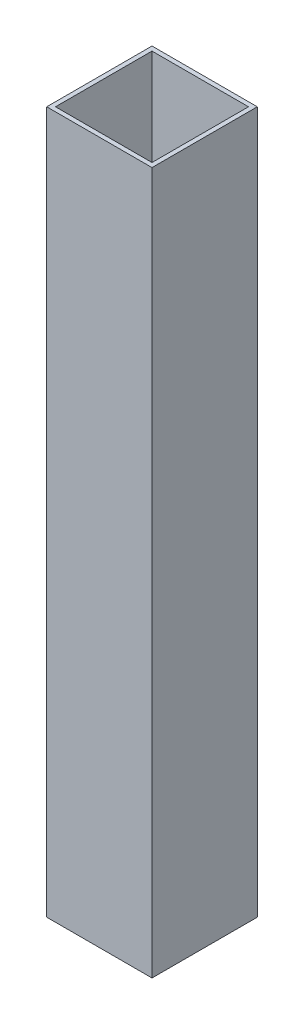
ISO-10303-21;
HEADER;
FILE_DESCRIPTION(('STEP AP214'),'2;1');
FILE_NAME('part.step','',(''),(''),'','','');
FILE_SCHEMA(('AUTOMOTIVE_DESIGN { 1 0 10303 214 1 1 1 1 }'));
ENDSEC;
DATA;
#1=APPLICATION_CONTEXT('core data for automotive mechanical design processes');
#2=APPLICATION_PROTOCOL_DEFINITION('international standard','automotive_design',2000,#1);
#3=PRODUCT_CONTEXT('',#1,'mechanical');
#4=PRODUCT('Part','Part','',(#3));
#5=PRODUCT_RELATED_PRODUCT_CATEGORY('part','',(#4));
#6=PRODUCT_DEFINITION_FORMATION('','',#4);
#7=PRODUCT_DEFINITION_CONTEXT('part definition',#1,'design');
#8=PRODUCT_DEFINITION('design','',#6,#7);
#9=PRODUCT_DEFINITION_SHAPE('','',#8);
#10=(LENGTH_UNIT() NAMED_UNIT(*) SI_UNIT(.MILLI.,.METRE.));
#11=(NAMED_UNIT(*) PLANE_ANGLE_UNIT() SI_UNIT($,.RADIAN.));
#12=(NAMED_UNIT(*) SI_UNIT($,.STERADIAN.) SOLID_ANGLE_UNIT());
#13=UNCERTAINTY_MEASURE_WITH_UNIT(LENGTH_MEASURE(1.E-05),#10,'distance_accuracy_value','');
#14=(GEOMETRIC_REPRESENTATION_CONTEXT(3) GLOBAL_UNCERTAINTY_ASSIGNED_CONTEXT((#13)) GLOBAL_UNIT_ASSIGNED_CONTEXT((#10,
#11,#12)) REPRESENTATION_CONTEXT('',''));
#15=CARTESIAN_POINT('',(0.,0.,0.));
#16=DIRECTION('',(0.,0.,1.));
#17=DIRECTION('',(1.,0.,0.));
#18=AXIS2_PLACEMENT_3D('',#15,#16,#17);
#19=CARTESIAN_POINT('',(0.,254.,0.));
#20=DIRECTION('',(0.,-1.,0.));
#21=DIRECTION('',(0.,0.,-1.));
#22=AXIS2_PLACEMENT_3D('',#19,#20,#21);
#23=PLANE('',#22);
#24=DIRECTION('',(0.,0.,1.));
#25=VECTOR('',#24,1.);
#26=CARTESIAN_POINT('',(-19.05,254.,-19.05));
#27=LINE('',#26,#25);
#28=CARTESIAN_POINT('',(-19.05,254.,-19.05));
#29=VERTEX_POINT('',#28);
#30=CARTESIAN_POINT('',(-19.05,254.,19.05));
#31=VERTEX_POINT('',#30);
#32=EDGE_CURVE('E142',#29,#31,#27,.T.);
#33=ORIENTED_EDGE('',*,*,#32,.T.);
#34=DIRECTION('',(1.,0.,0.));
#35=VECTOR('',#34,1.);
#36=CARTESIAN_POINT('',(19.05,254.,19.05));
#37=LINE('',#36,#35);
#38=CARTESIAN_POINT('',(19.05,254.,19.05));
#39=VERTEX_POINT('',#38);
#40=EDGE_CURVE('E145',#31,#39,#37,.T.);
#41=ORIENTED_EDGE('',*,*,#40,.T.);
#42=DIRECTION('',(0.,0.,-1.));
#43=VECTOR('',#42,1.);
#44=CARTESIAN_POINT('',(19.05,254.,-19.05));
#45=LINE('',#44,#43);
#46=CARTESIAN_POINT('',(19.05,254.,-19.05));
#47=VERTEX_POINT('',#46);
#48=EDGE_CURVE('E148',#39,#47,#45,.T.);
#49=ORIENTED_EDGE('',*,*,#48,.T.);
#50=DIRECTION('',(-1.,0.,0.));
#51=VECTOR('',#50,1.);
#52=CARTESIAN_POINT('',(19.05,254.,-19.05));
#53=LINE('',#52,#51);
#54=EDGE_CURVE('E150',#47,#29,#53,.T.);
#55=ORIENTED_EDGE('',*,*,#54,.T.);
#56=EDGE_LOOP('',(#33,#41,#49,#55));
#57=FACE_BOUND('',#56,.T.);
#58=DIRECTION('',(0.,0.,1.));
#59=VECTOR('',#58,1.);
#60=CARTESIAN_POINT('',(-17.4625,254.,17.4625));
#61=LINE('',#60,#59);
#62=CARTESIAN_POINT('',(-17.4625,254.,-17.4625));
#63=VERTEX_POINT('',#62);
#64=CARTESIAN_POINT('',(-17.4625,254.,17.4625));
#65=VERTEX_POINT('',#64);
#66=EDGE_CURVE('E106',#63,#65,#61,.T.);
#67=ORIENTED_EDGE('',*,*,#66,.F.);
#68=DIRECTION('',(-1.,0.,0.));
#69=VECTOR('',#68,1.);
#70=CARTESIAN_POINT('',(17.4625,254.,-17.4625));
#71=LINE('',#70,#69);
#72=CARTESIAN_POINT('',(17.4625,254.,-17.4625));
#73=VERTEX_POINT('',#72);
#74=EDGE_CURVE('E128',#73,#63,#71,.T.);
#75=ORIENTED_EDGE('',*,*,#74,.F.);
#76=DIRECTION('',(0.,0.,-1.));
#77=VECTOR('',#76,1.);
#78=CARTESIAN_POINT('',(17.4625,254.,17.4625));
#79=LINE('',#78,#77);
#80=CARTESIAN_POINT('',(17.4625,254.,17.4625));
#81=VERTEX_POINT('',#80);
#82=EDGE_CURVE('E126',#81,#73,#79,.T.);
#83=ORIENTED_EDGE('',*,*,#82,.F.);
#84=DIRECTION('',(1.,0.,0.));
#85=VECTOR('',#84,1.);
#86=CARTESIAN_POINT('',(17.4625,254.,17.4625));
#87=LINE('',#86,#85);
#88=EDGE_CURVE('E114',#65,#81,#87,.T.);
#89=ORIENTED_EDGE('',*,*,#88,.F.);
#90=EDGE_LOOP('',(#67,#75,#83,#89));
#91=FACE_BOUND('',#90,.T.);
#92=ADVANCED_FACE('F41',(#57,#91),#23,.F.);
#93=CARTESIAN_POINT('',(0.,0.,0.));
#94=DIRECTION('',(0.,-1.,0.));
#95=DIRECTION('',(0.,0.,-1.));
#96=AXIS2_PLACEMENT_3D('',#93,#94,#95);
#97=PLANE('',#96);
#98=DIRECTION('',(0.,0.,1.));
#99=VECTOR('',#98,1.);
#100=CARTESIAN_POINT('',(-19.05,0.,-19.05));
#101=LINE('',#100,#99);
#102=CARTESIAN_POINT('',(-19.05,0.,-19.05));
#103=VERTEX_POINT('',#102);
#104=CARTESIAN_POINT('',(-19.05,0.,19.05));
#105=VERTEX_POINT('',#104);
#106=EDGE_CURVE('E122',#103,#105,#101,.T.);
#107=ORIENTED_EDGE('',*,*,#106,.F.);
#108=DIRECTION('',(-1.,0.,0.));
#109=VECTOR('',#108,1.);
#110=CARTESIAN_POINT('',(19.05,0.,-19.05));
#111=LINE('',#110,#109);
#112=CARTESIAN_POINT('',(19.05,0.,-19.05));
#113=VERTEX_POINT('',#112);
#114=EDGE_CURVE('E146',#113,#103,#111,.T.);
#115=ORIENTED_EDGE('',*,*,#114,.F.);
#116=DIRECTION('',(0.,0.,-1.));
#117=VECTOR('',#116,1.);
#118=CARTESIAN_POINT('',(19.05,0.,-19.05));
#119=LINE('',#118,#117);
#120=CARTESIAN_POINT('',(19.05,0.,19.05));
#121=VERTEX_POINT('',#120);
#122=EDGE_CURVE('E157',#121,#113,#119,.T.);
#123=ORIENTED_EDGE('',*,*,#122,.F.);
#124=DIRECTION('',(1.,0.,0.));
#125=VECTOR('',#124,1.);
#126=CARTESIAN_POINT('',(19.05,0.,19.05));
#127=LINE('',#126,#125);
#128=EDGE_CURVE('E155',#105,#121,#127,.T.);
#129=ORIENTED_EDGE('',*,*,#128,.F.);
#130=EDGE_LOOP('',(#107,#115,#123,#129));
#131=FACE_BOUND('',#130,.T.);
#132=DIRECTION('',(-1.,0.,0.));
#133=VECTOR('',#132,1.);
#134=CARTESIAN_POINT('',(17.4625,0.,-17.4625));
#135=LINE('',#134,#133);
#136=CARTESIAN_POINT('',(17.4625,0.,-17.4625));
#137=VERTEX_POINT('',#136);
#138=CARTESIAN_POINT('',(-17.4625,0.,-17.4625));
#139=VERTEX_POINT('',#138);
#140=EDGE_CURVE('E115',#137,#139,#135,.T.);
#141=ORIENTED_EDGE('',*,*,#140,.T.);
#142=DIRECTION('',(0.,0.,1.));
#143=VECTOR('',#142,1.);
#144=CARTESIAN_POINT('',(-17.4625,0.,17.4625));
#145=LINE('',#144,#143);
#146=CARTESIAN_POINT('',(-17.4625,0.,17.4625));
#147=VERTEX_POINT('',#146);
#148=EDGE_CURVE('E64',#139,#147,#145,.T.);
#149=ORIENTED_EDGE('',*,*,#148,.T.);
#150=DIRECTION('',(1.,0.,0.));
#151=VECTOR('',#150,1.);
#152=CARTESIAN_POINT('',(17.4625,0.,17.4625));
#153=LINE('',#152,#151);
#154=CARTESIAN_POINT('',(17.4625,0.,17.4625));
#155=VERTEX_POINT('',#154);
#156=EDGE_CURVE('E121',#147,#155,#153,.T.);
#157=ORIENTED_EDGE('',*,*,#156,.T.);
#158=DIRECTION('',(0.,0.,-1.));
#159=VECTOR('',#158,1.);
#160=CARTESIAN_POINT('',(17.4625,0.,17.4625));
#161=LINE('',#160,#159);
#162=EDGE_CURVE('E134',#155,#137,#161,.T.);
#163=ORIENTED_EDGE('',*,*,#162,.T.);
#164=EDGE_LOOP('',(#141,#149,#157,#163));
#165=FACE_BOUND('',#164,.T.);
#166=ADVANCED_FACE('F175',(#131,#165),#97,.T.);
#167=CARTESIAN_POINT('',(-19.05,254.,-19.05));
#168=DIRECTION('',(1.,0.,0.));
#169=DIRECTION('',(0.,0.,-1.));
#170=AXIS2_PLACEMENT_3D('',#167,#168,#169);
#171=PLANE('',#170);
#172=ORIENTED_EDGE('',*,*,#106,.T.);
#173=DIRECTION('',(0.,-1.,0.));
#174=VECTOR('',#173,1.);
#175=CARTESIAN_POINT('',(-19.05,254.,19.05));
#176=LINE('',#175,#174);
#177=EDGE_CURVE('E11',#31,#105,#176,.T.);
#178=ORIENTED_EDGE('',*,*,#177,.F.);
#179=ORIENTED_EDGE('',*,*,#32,.F.);
#180=DIRECTION('',(0.,-1.,0.));
#181=VECTOR('',#180,1.);
#182=CARTESIAN_POINT('',(-19.05,254.,-19.05));
#183=LINE('',#182,#181);
#184=EDGE_CURVE('E152',#29,#103,#183,.T.);
#185=ORIENTED_EDGE('',*,*,#184,.T.);
#186=EDGE_LOOP('',(#172,#178,#179,#185));
#187=FACE_BOUND('',#186,.T.);
#188=ADVANCED_FACE('F43',(#187),#171,.F.);
#189=CARTESIAN_POINT('',(19.05,254.,19.05));
#190=DIRECTION('',(0.,0.,-1.));
#191=DIRECTION('',(-1.,0.,0.));
#192=AXIS2_PLACEMENT_3D('',#189,#190,#191);
#193=PLANE('',#192);
#194=ORIENTED_EDGE('',*,*,#128,.T.);
#195=DIRECTION('',(0.,-1.,0.));
#196=VECTOR('',#195,1.);
#197=CARTESIAN_POINT('',(19.05,254.,19.05));
#198=LINE('',#197,#196);
#199=EDGE_CURVE('E49',#39,#121,#198,.T.);
#200=ORIENTED_EDGE('',*,*,#199,.F.);
#201=ORIENTED_EDGE('',*,*,#40,.F.);
#202=ORIENTED_EDGE('',*,*,#177,.T.);
#203=EDGE_LOOP('',(#194,#200,#201,#202));
#204=FACE_BOUND('',#203,.T.);
#205=ADVANCED_FACE('F185',(#204),#193,.F.);
#206=CARTESIAN_POINT('',(19.05,254.,-19.05));
#207=DIRECTION('',(-1.,0.,0.));
#208=DIRECTION('',(0.,0.,1.));
#209=AXIS2_PLACEMENT_3D('',#206,#207,#208);
#210=PLANE('',#209);
#211=ORIENTED_EDGE('',*,*,#122,.T.);
#212=DIRECTION('',(0.,-1.,0.));
#213=VECTOR('',#212,1.);
#214=CARTESIAN_POINT('',(19.05,254.,-19.05));
#215=LINE('',#214,#213);
#216=EDGE_CURVE('E162',#47,#113,#215,.T.);
#217=ORIENTED_EDGE('',*,*,#216,.F.);
#218=ORIENTED_EDGE('',*,*,#48,.F.);
#219=ORIENTED_EDGE('',*,*,#199,.T.);
#220=EDGE_LOOP('',(#211,#217,#218,#219));
#221=FACE_BOUND('',#220,.T.);
#222=ADVANCED_FACE('F169',(#221),#210,.F.);
#223=CARTESIAN_POINT('',(19.05,254.,-19.05));
#224=DIRECTION('',(0.,0.,1.));
#225=DIRECTION('',(1.,0.,0.));
#226=AXIS2_PLACEMENT_3D('',#223,#224,#225);
#227=PLANE('',#226);
#228=ORIENTED_EDGE('',*,*,#114,.T.);
#229=ORIENTED_EDGE('',*,*,#184,.F.);
#230=ORIENTED_EDGE('',*,*,#54,.F.);
#231=ORIENTED_EDGE('',*,*,#216,.T.);
#232=EDGE_LOOP('',(#228,#229,#230,#231));
#233=FACE_BOUND('',#232,.T.);
#234=ADVANCED_FACE('F179',(#233),#227,.F.);
#235=CARTESIAN_POINT('',(-17.4625,254.,17.4625));
#236=DIRECTION('',(1.,0.,0.));
#237=DIRECTION('',(0.,0.,-1.));
#238=AXIS2_PLACEMENT_3D('',#235,#236,#237);
#239=PLANE('',#238);
#240=ORIENTED_EDGE('',*,*,#148,.F.);
#241=DIRECTION('',(0.,-1.,0.));
#242=VECTOR('',#241,1.);
#243=CARTESIAN_POINT('',(-17.4625,254.,-17.4625));
#244=LINE('',#243,#242);
#245=EDGE_CURVE('E110',#63,#139,#244,.T.);
#246=ORIENTED_EDGE('',*,*,#245,.F.);
#247=ORIENTED_EDGE('',*,*,#66,.T.);
#248=DIRECTION('',(0.,-1.,0.));
#249=VECTOR('',#248,1.);
#250=CARTESIAN_POINT('',(-17.4625,254.,17.4625));
#251=LINE('',#250,#249);
#252=EDGE_CURVE('E109',#65,#147,#251,.T.);
#253=ORIENTED_EDGE('',*,*,#252,.T.);
#254=EDGE_LOOP('',(#240,#246,#247,#253));
#255=FACE_BOUND('',#254,.T.);
#256=ADVANCED_FACE('F108',(#255),#239,.T.);
#257=CARTESIAN_POINT('',(17.4625,254.,17.4625));
#258=DIRECTION('',(0.,0.,-1.));
#259=DIRECTION('',(-1.,0.,0.));
#260=AXIS2_PLACEMENT_3D('',#257,#258,#259);
#261=PLANE('',#260);
#262=ORIENTED_EDGE('',*,*,#156,.F.);
#263=ORIENTED_EDGE('',*,*,#252,.F.);
#264=ORIENTED_EDGE('',*,*,#88,.T.);
#265=DIRECTION('',(0.,-1.,0.));
#266=VECTOR('',#265,1.);
#267=CARTESIAN_POINT('',(17.4625,254.,17.4625));
#268=LINE('',#267,#266);
#269=EDGE_CURVE('E123',#81,#155,#268,.T.);
#270=ORIENTED_EDGE('',*,*,#269,.T.);
#271=EDGE_LOOP('',(#262,#263,#264,#270));
#272=FACE_BOUND('',#271,.T.);
#273=ADVANCED_FACE('F118',(#272),#261,.T.);
#274=CARTESIAN_POINT('',(17.4625,254.,17.4625));
#275=DIRECTION('',(-1.,0.,0.));
#276=DIRECTION('',(0.,0.,1.));
#277=AXIS2_PLACEMENT_3D('',#274,#275,#276);
#278=PLANE('',#277);
#279=ORIENTED_EDGE('',*,*,#162,.F.);
#280=ORIENTED_EDGE('',*,*,#269,.F.);
#281=ORIENTED_EDGE('',*,*,#82,.T.);
#282=DIRECTION('',(0.,-1.,0.));
#283=VECTOR('',#282,1.);
#284=CARTESIAN_POINT('',(17.4625,254.,-17.4625));
#285=LINE('',#284,#283);
#286=EDGE_CURVE('E56',#73,#137,#285,.T.);
#287=ORIENTED_EDGE('',*,*,#286,.T.);
#288=EDGE_LOOP('',(#279,#280,#281,#287));
#289=FACE_BOUND('',#288,.T.);
#290=ADVANCED_FACE('F208',(#289),#278,.T.);
#291=CARTESIAN_POINT('',(17.4625,254.,-17.4625));
#292=DIRECTION('',(0.,0.,1.));
#293=DIRECTION('',(1.,0.,0.));
#294=AXIS2_PLACEMENT_3D('',#291,#292,#293);
#295=PLANE('',#294);
#296=ORIENTED_EDGE('',*,*,#140,.F.);
#297=ORIENTED_EDGE('',*,*,#286,.F.);
#298=ORIENTED_EDGE('',*,*,#74,.T.);
#299=ORIENTED_EDGE('',*,*,#245,.T.);
#300=EDGE_LOOP('',(#296,#297,#298,#299));
#301=FACE_BOUND('',#300,.T.);
#302=ADVANCED_FACE('F212',(#301),#295,.T.);
#303=CLOSED_SHELL('',(#92,#166,#188,#205,#222,#234,#256,#273,#290,#302));
#304=MANIFOLD_SOLID_BREP('B2',#303);
#305=ADVANCED_BREP_SHAPE_REPRESENTATION('',(#18,#304),#14);
#306=SHAPE_DEFINITION_REPRESENTATION(#9,#305);
ENDSEC;
END-ISO-10303-21;
